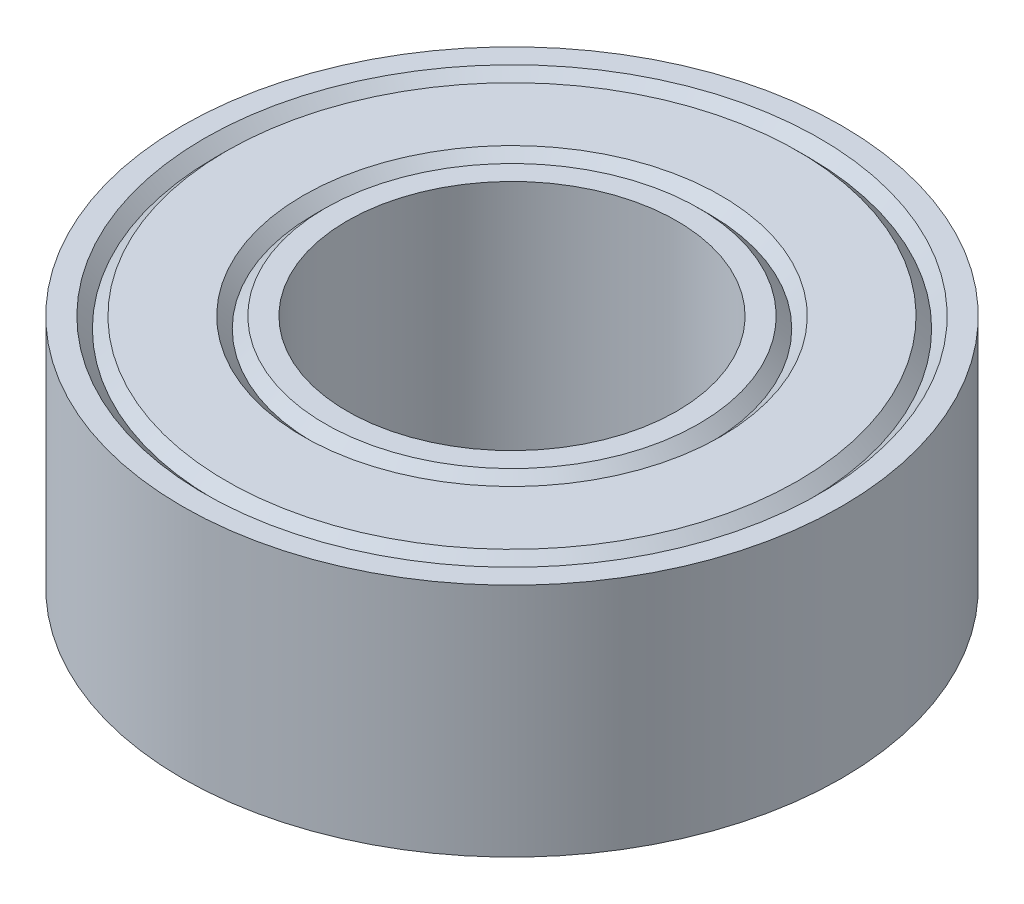
ISO-10303-21;
HEADER;
FILE_DESCRIPTION(('STEP AP214'),'2;1');
FILE_NAME('part.step','',(''),(''),'','','');
FILE_SCHEMA(('AUTOMOTIVE_DESIGN { 1 0 10303 214 1 1 1 1 }'));
ENDSEC;
DATA;
#1=APPLICATION_CONTEXT('core data for automotive mechanical design processes');
#2=APPLICATION_PROTOCOL_DEFINITION('international standard','automotive_design',2000,#1);
#3=PRODUCT_CONTEXT('',#1,'mechanical');
#4=PRODUCT('Part','Part','',(#3));
#5=PRODUCT_RELATED_PRODUCT_CATEGORY('part','',(#4));
#6=PRODUCT_DEFINITION_FORMATION('','',#4);
#7=PRODUCT_DEFINITION_CONTEXT('part definition',#1,'design');
#8=PRODUCT_DEFINITION('design','',#6,#7);
#9=PRODUCT_DEFINITION_SHAPE('','',#8);
#10=(LENGTH_UNIT() NAMED_UNIT(*) SI_UNIT(.MILLI.,.METRE.));
#11=(NAMED_UNIT(*) PLANE_ANGLE_UNIT() SI_UNIT($,.RADIAN.));
#12=(NAMED_UNIT(*) SI_UNIT($,.STERADIAN.) SOLID_ANGLE_UNIT());
#13=UNCERTAINTY_MEASURE_WITH_UNIT(LENGTH_MEASURE(1.E-05),#10,'distance_accuracy_value','');
#14=(GEOMETRIC_REPRESENTATION_CONTEXT(3) GLOBAL_UNCERTAINTY_ASSIGNED_CONTEXT((#13)) GLOBAL_UNIT_ASSIGNED_CONTEXT((#10,
#11,#12)) REPRESENTATION_CONTEXT('',''));
#15=CARTESIAN_POINT('',(0.,0.,0.));
#16=DIRECTION('',(0.,0.,1.));
#17=DIRECTION('',(1.,0.,0.));
#18=AXIS2_PLACEMENT_3D('',#15,#16,#17);
#19=CARTESIAN_POINT('',(0.,2.5,0.));
#20=DIRECTION('',(0.,1.,0.));
#21=DIRECTION('',(-1.,0.,0.));
#22=AXIS2_PLACEMENT_3D('',#19,#20,#21);
#23=CYLINDRICAL_SURFACE('',#22,3.5);
#24=CARTESIAN_POINT('',(0.,2.49999999999999,0.));
#25=DIRECTION('',(0.,1.,0.));
#26=DIRECTION('',(-1.,0.,0.));
#27=AXIS2_PLACEMENT_3D('',#24,#25,#26);
#28=CIRCLE('',#27,3.5);
#29=CARTESIAN_POINT('',(-3.5,2.49999999999999,0.));
#30=VERTEX_POINT('',#29);
#31=EDGE_CURVE('E83',#30,#30,#28,.T.);
#32=ORIENTED_EDGE('',*,*,#31,.T.);
#33=EDGE_LOOP('',(#32));
#34=FACE_BOUND('',#33,.T.);
#35=CARTESIAN_POINT('',(0.,-2.49999999999999,0.));
#36=DIRECTION('',(0.,1.,0.));
#37=DIRECTION('',(-1.,0.,0.));
#38=AXIS2_PLACEMENT_3D('',#35,#36,#37);
#39=CIRCLE('',#38,3.5);
#40=CARTESIAN_POINT('',(-3.5,-2.49999999999999,0.));
#41=VERTEX_POINT('',#40);
#42=EDGE_CURVE('E10',#41,#41,#39,.T.);
#43=ORIENTED_EDGE('',*,*,#42,.F.);
#44=EDGE_LOOP('',(#43));
#45=FACE_BOUND('',#44,.T.);
#46=ADVANCED_FACE('F31',(#34,#45),#23,.F.);
#47=CARTESIAN_POINT('',(-3.5,-2.5,0.));
#48=DIRECTION('',(0.,-1.,0.));
#49=DIRECTION('',(1.,0.,0.));
#50=AXIS2_PLACEMENT_3D('',#47,#48,#49);
#51=PLANE('',#50);
#52=ORIENTED_EDGE('',*,*,#42,.T.);
#53=EDGE_LOOP('',(#52));
#54=FACE_BOUND('',#53,.T.);
#55=CARTESIAN_POINT('',(0.,-2.5,0.));
#56=DIRECTION('',(0.,1.,0.));
#57=DIRECTION('',(-1.,0.,0.));
#58=AXIS2_PLACEMENT_3D('',#55,#56,#57);
#59=CIRCLE('',#58,3.96666666666667);
#60=CARTESIAN_POINT('',(-3.96666666666667,-2.5,0.));
#61=VERTEX_POINT('',#60);
#62=EDGE_CURVE('E37',#61,#61,#59,.T.);
#63=ORIENTED_EDGE('',*,*,#62,.F.);
#64=EDGE_LOOP('',(#63));
#65=FACE_BOUND('',#64,.T.);
#66=ADVANCED_FACE('F101',(#54,#65),#51,.T.);
#67=CARTESIAN_POINT('',(0.,-2.26666666666667,0.));
#68=DIRECTION('',(0.,1.,0.));
#69=DIRECTION('',(-1.,0.,0.));
#70=AXIS2_PLACEMENT_3D('',#67,#68,#69);
#71=CONICAL_SURFACE('',#70,4.2,0.785398163397454);
#72=ORIENTED_EDGE('',*,*,#62,.T.);
#73=EDGE_LOOP('',(#72));
#74=FACE_BOUND('',#73,.T.);
#75=CARTESIAN_POINT('',(0.,-2.26666666666667,0.));
#76=DIRECTION('',(0.,1.,0.));
#77=DIRECTION('',(-1.,0.,0.));
#78=AXIS2_PLACEMENT_3D('',#75,#76,#77);
#79=CIRCLE('',#78,4.2);
#80=CARTESIAN_POINT('',(-4.2,-2.26666666666667,0.));
#81=VERTEX_POINT('',#80);
#82=EDGE_CURVE('E41',#81,#81,#79,.T.);
#83=ORIENTED_EDGE('',*,*,#82,.F.);
#84=EDGE_LOOP('',(#83));
#85=FACE_BOUND('',#84,.T.);
#86=ADVANCED_FACE('F105',(#74,#85),#71,.T.);
#87=CARTESIAN_POINT('',(0.,-2.5,0.));
#88=DIRECTION('',(0.,-1.,0.));
#89=DIRECTION('',(1.,0.,0.));
#90=AXIS2_PLACEMENT_3D('',#87,#88,#89);
#91=CONICAL_SURFACE('',#90,4.43333333333333,0.785398163397448);
#92=ORIENTED_EDGE('',*,*,#82,.T.);
#93=EDGE_LOOP('',(#92));
#94=FACE_BOUND('',#93,.T.);
#95=CARTESIAN_POINT('',(0.,-2.5,0.));
#96=DIRECTION('',(0.,1.,0.));
#97=DIRECTION('',(-1.,0.,0.));
#98=AXIS2_PLACEMENT_3D('',#95,#96,#97);
#99=CIRCLE('',#98,4.43333333333333);
#100=CARTESIAN_POINT('',(-4.43333333333333,-2.5,0.));
#101=VERTEX_POINT('',#100);
#102=EDGE_CURVE('E45',#101,#101,#99,.T.);
#103=ORIENTED_EDGE('',*,*,#102,.F.);
#104=EDGE_LOOP('',(#103));
#105=FACE_BOUND('',#104,.T.);
#106=ADVANCED_FACE('F109',(#94,#105),#91,.F.);
#107=CARTESIAN_POINT('',(-4.43333333333333,-2.5,0.));
#108=DIRECTION('',(0.,-1.,0.));
#109=DIRECTION('',(1.,0.,0.));
#110=AXIS2_PLACEMENT_3D('',#107,#108,#109);
#111=PLANE('',#110);
#112=ORIENTED_EDGE('',*,*,#102,.T.);
#113=EDGE_LOOP('',(#112));
#114=FACE_BOUND('',#113,.T.);
#115=CARTESIAN_POINT('',(0.,-2.5,0.));
#116=DIRECTION('',(0.,1.,0.));
#117=DIRECTION('',(-1.,0.,0.));
#118=AXIS2_PLACEMENT_3D('',#115,#116,#117);
#119=CIRCLE('',#118,6.06666666666667);
#120=CARTESIAN_POINT('',(-6.06666666666667,-2.5,0.));
#121=VERTEX_POINT('',#120);
#122=EDGE_CURVE('E50',#121,#121,#119,.T.);
#123=ORIENTED_EDGE('',*,*,#122,.F.);
#124=EDGE_LOOP('',(#123));
#125=FACE_BOUND('',#124,.T.);
#126=ADVANCED_FACE('F115',(#114,#125),#111,.T.);
#127=CARTESIAN_POINT('',(0.,-2.26666666666667,0.));
#128=DIRECTION('',(0.,1.,0.));
#129=DIRECTION('',(-1.,0.,0.));
#130=AXIS2_PLACEMENT_3D('',#127,#128,#129);
#131=CONICAL_SURFACE('',#130,6.30000000000001,0.785398163397458);
#132=ORIENTED_EDGE('',*,*,#122,.T.);
#133=EDGE_LOOP('',(#132));
#134=FACE_BOUND('',#133,.T.);
#135=CARTESIAN_POINT('',(0.,-2.26666666666667,0.));
#136=DIRECTION('',(0.,1.,0.));
#137=DIRECTION('',(-1.,0.,0.));
#138=AXIS2_PLACEMENT_3D('',#135,#136,#137);
#139=CIRCLE('',#138,6.30000000000001);
#140=CARTESIAN_POINT('',(-6.30000000000001,-2.26666666666667,0.));
#141=VERTEX_POINT('',#140);
#142=EDGE_CURVE('E53',#141,#141,#139,.T.);
#143=ORIENTED_EDGE('',*,*,#142,.F.);
#144=EDGE_LOOP('',(#143));
#145=FACE_BOUND('',#144,.T.);
#146=ADVANCED_FACE('F119',(#134,#145),#131,.T.);
#147=CARTESIAN_POINT('',(0.,-2.5,0.));
#148=DIRECTION('',(0.,-1.,0.));
#149=DIRECTION('',(1.,0.,0.));
#150=AXIS2_PLACEMENT_3D('',#147,#148,#149);
#151=CONICAL_SURFACE('',#150,6.53333333333334,0.785398163397447);
#152=ORIENTED_EDGE('',*,*,#142,.T.);
#153=EDGE_LOOP('',(#152));
#154=FACE_BOUND('',#153,.T.);
#155=CARTESIAN_POINT('',(0.,-2.5,0.));
#156=DIRECTION('',(0.,1.,0.));
#157=DIRECTION('',(-1.,0.,0.));
#158=AXIS2_PLACEMENT_3D('',#155,#156,#157);
#159=CIRCLE('',#158,6.53333333333334);
#160=CARTESIAN_POINT('',(-6.53333333333334,-2.5,0.));
#161=VERTEX_POINT('',#160);
#162=EDGE_CURVE('E56',#161,#161,#159,.T.);
#163=ORIENTED_EDGE('',*,*,#162,.F.);
#164=EDGE_LOOP('',(#163));
#165=FACE_BOUND('',#164,.T.);
#166=ADVANCED_FACE('F123',(#154,#165),#151,.F.);
#167=CARTESIAN_POINT('',(-6.53333333333334,-2.5,0.));
#168=DIRECTION('',(0.,-1.,0.));
#169=DIRECTION('',(1.,0.,0.));
#170=AXIS2_PLACEMENT_3D('',#167,#168,#169);
#171=PLANE('',#170);
#172=ORIENTED_EDGE('',*,*,#162,.T.);
#173=EDGE_LOOP('',(#172));
#174=FACE_BOUND('',#173,.T.);
#175=CARTESIAN_POINT('',(0.,-2.5,0.));
#176=DIRECTION('',(0.,1.,0.));
#177=DIRECTION('',(-1.,0.,0.));
#178=AXIS2_PLACEMENT_3D('',#175,#176,#177);
#179=CIRCLE('',#178,7.);
#180=CARTESIAN_POINT('',(-7.,-2.5,0.));
#181=VERTEX_POINT('',#180);
#182=EDGE_CURVE('E59',#181,#181,#179,.T.);
#183=ORIENTED_EDGE('',*,*,#182,.F.);
#184=EDGE_LOOP('',(#183));
#185=FACE_BOUND('',#184,.T.);
#186=ADVANCED_FACE('F127',(#174,#185),#171,.T.);
#187=CARTESIAN_POINT('',(0.,2.5,0.));
#188=DIRECTION('',(0.,1.,0.));
#189=DIRECTION('',(-1.,0.,0.));
#190=AXIS2_PLACEMENT_3D('',#187,#188,#189);
#191=CYLINDRICAL_SURFACE('',#190,7.);
#192=ORIENTED_EDGE('',*,*,#182,.T.);
#193=EDGE_LOOP('',(#192));
#194=FACE_BOUND('',#193,.T.);
#195=CARTESIAN_POINT('',(0.,2.5,0.));
#196=DIRECTION('',(0.,1.,0.));
#197=DIRECTION('',(-1.,0.,0.));
#198=AXIS2_PLACEMENT_3D('',#195,#196,#197);
#199=CIRCLE('',#198,7.);
#200=CARTESIAN_POINT('',(-7.,2.5,0.));
#201=VERTEX_POINT('',#200);
#202=EDGE_CURVE('E62',#201,#201,#199,.T.);
#203=ORIENTED_EDGE('',*,*,#202,.F.);
#204=EDGE_LOOP('',(#203));
#205=FACE_BOUND('',#204,.T.);
#206=ADVANCED_FACE('F131',(#194,#205),#191,.T.);
#207=CARTESIAN_POINT('',(-6.53333333333334,2.5,0.));
#208=DIRECTION('',(0.,1.,0.));
#209=DIRECTION('',(-1.,0.,0.));
#210=AXIS2_PLACEMENT_3D('',#207,#208,#209);
#211=PLANE('',#210);
#212=ORIENTED_EDGE('',*,*,#202,.T.);
#213=EDGE_LOOP('',(#212));
#214=FACE_BOUND('',#213,.T.);
#215=CARTESIAN_POINT('',(0.,2.5,0.));
#216=DIRECTION('',(0.,1.,0.));
#217=DIRECTION('',(-1.,0.,0.));
#218=AXIS2_PLACEMENT_3D('',#215,#216,#217);
#219=CIRCLE('',#218,6.53333333333334);
#220=CARTESIAN_POINT('',(-6.53333333333334,2.5,0.));
#221=VERTEX_POINT('',#220);
#222=EDGE_CURVE('E65',#221,#221,#219,.T.);
#223=ORIENTED_EDGE('',*,*,#222,.F.);
#224=EDGE_LOOP('',(#223));
#225=FACE_BOUND('',#224,.T.);
#226=ADVANCED_FACE('F135',(#214,#225),#211,.T.);
#227=CARTESIAN_POINT('',(0.,2.26666666666667,0.));
#228=DIRECTION('',(0.,1.,0.));
#229=DIRECTION('',(-1.,0.,0.));
#230=AXIS2_PLACEMENT_3D('',#227,#228,#229);
#231=CONICAL_SURFACE('',#230,6.30000000000001,0.785398163397447);
#232=ORIENTED_EDGE('',*,*,#222,.T.);
#233=EDGE_LOOP('',(#232));
#234=FACE_BOUND('',#233,.T.);
#235=CARTESIAN_POINT('',(0.,2.26666666666667,0.));
#236=DIRECTION('',(0.,1.,0.));
#237=DIRECTION('',(-1.,0.,0.));
#238=AXIS2_PLACEMENT_3D('',#235,#236,#237);
#239=CIRCLE('',#238,6.30000000000001);
#240=CARTESIAN_POINT('',(-6.30000000000001,2.26666666666667,0.));
#241=VERTEX_POINT('',#240);
#242=EDGE_CURVE('E68',#241,#241,#239,.T.);
#243=ORIENTED_EDGE('',*,*,#242,.F.);
#244=EDGE_LOOP('',(#243));
#245=FACE_BOUND('',#244,.T.);
#246=ADVANCED_FACE('F139',(#234,#245),#231,.F.);
#247=CARTESIAN_POINT('',(0.,2.5,0.));
#248=DIRECTION('',(0.,-1.,0.));
#249=DIRECTION('',(1.,0.,0.));
#250=AXIS2_PLACEMENT_3D('',#247,#248,#249);
#251=CONICAL_SURFACE('',#250,6.06666666666667,0.78539816339746);
#252=ORIENTED_EDGE('',*,*,#242,.T.);
#253=EDGE_LOOP('',(#252));
#254=FACE_BOUND('',#253,.T.);
#255=CARTESIAN_POINT('',(0.,2.5,0.));
#256=DIRECTION('',(0.,1.,0.));
#257=DIRECTION('',(-1.,0.,0.));
#258=AXIS2_PLACEMENT_3D('',#255,#256,#257);
#259=CIRCLE('',#258,6.06666666666667);
#260=CARTESIAN_POINT('',(-6.06666666666667,2.5,0.));
#261=VERTEX_POINT('',#260);
#262=EDGE_CURVE('E71',#261,#261,#259,.T.);
#263=ORIENTED_EDGE('',*,*,#262,.F.);
#264=EDGE_LOOP('',(#263));
#265=FACE_BOUND('',#264,.T.);
#266=ADVANCED_FACE('F143',(#254,#265),#251,.T.);
#267=CARTESIAN_POINT('',(-4.43333333333333,2.5,0.));
#268=DIRECTION('',(0.,1.,0.));
#269=DIRECTION('',(-1.,0.,0.));
#270=AXIS2_PLACEMENT_3D('',#267,#268,#269);
#271=PLANE('',#270);
#272=ORIENTED_EDGE('',*,*,#262,.T.);
#273=EDGE_LOOP('',(#272));
#274=FACE_BOUND('',#273,.T.);
#275=CARTESIAN_POINT('',(0.,2.5,0.));
#276=DIRECTION('',(0.,1.,0.));
#277=DIRECTION('',(-1.,0.,0.));
#278=AXIS2_PLACEMENT_3D('',#275,#276,#277);
#279=CIRCLE('',#278,4.43333333333333);
#280=CARTESIAN_POINT('',(-4.43333333333333,2.5,0.));
#281=VERTEX_POINT('',#280);
#282=EDGE_CURVE('E74',#281,#281,#279,.T.);
#283=ORIENTED_EDGE('',*,*,#282,.F.);
#284=EDGE_LOOP('',(#283));
#285=FACE_BOUND('',#284,.T.);
#286=ADVANCED_FACE('F147',(#274,#285),#271,.T.);
#287=CARTESIAN_POINT('',(0.,2.26666666666667,0.));
#288=DIRECTION('',(0.,1.,0.));
#289=DIRECTION('',(-1.,0.,0.));
#290=AXIS2_PLACEMENT_3D('',#287,#288,#289);
#291=CONICAL_SURFACE('',#290,4.2,0.785398163397448);
#292=ORIENTED_EDGE('',*,*,#282,.T.);
#293=EDGE_LOOP('',(#292));
#294=FACE_BOUND('',#293,.T.);
#295=CARTESIAN_POINT('',(0.,2.26666666666667,0.));
#296=DIRECTION('',(0.,1.,0.));
#297=DIRECTION('',(-1.,0.,0.));
#298=AXIS2_PLACEMENT_3D('',#295,#296,#297);
#299=CIRCLE('',#298,4.2);
#300=CARTESIAN_POINT('',(-4.2,2.26666666666667,0.));
#301=VERTEX_POINT('',#300);
#302=EDGE_CURVE('E77',#301,#301,#299,.T.);
#303=ORIENTED_EDGE('',*,*,#302,.F.);
#304=EDGE_LOOP('',(#303));
#305=FACE_BOUND('',#304,.T.);
#306=ADVANCED_FACE('F97',(#294,#305),#291,.F.);
#307=CARTESIAN_POINT('',(0.,2.5,0.));
#308=DIRECTION('',(0.,-1.,0.));
#309=DIRECTION('',(1.,0.,0.));
#310=AXIS2_PLACEMENT_3D('',#307,#308,#309);
#311=CONICAL_SURFACE('',#310,3.96666666666667,0.785398163397449);
#312=ORIENTED_EDGE('',*,*,#302,.T.);
#313=EDGE_LOOP('',(#312));
#314=FACE_BOUND('',#313,.T.);
#315=CARTESIAN_POINT('',(0.,2.5,0.));
#316=DIRECTION('',(0.,1.,0.));
#317=DIRECTION('',(-1.,0.,0.));
#318=AXIS2_PLACEMENT_3D('',#315,#316,#317);
#319=CIRCLE('',#318,3.96666666666667);
#320=CARTESIAN_POINT('',(-3.96666666666667,2.5,0.));
#321=VERTEX_POINT('',#320);
#322=EDGE_CURVE('E80',#321,#321,#319,.T.);
#323=ORIENTED_EDGE('',*,*,#322,.F.);
#324=EDGE_LOOP('',(#323));
#325=FACE_BOUND('',#324,.T.);
#326=ADVANCED_FACE('F91',(#314,#325),#311,.T.);
#327=CARTESIAN_POINT('',(-3.5,2.5,0.));
#328=DIRECTION('',(0.,1.,0.));
#329=DIRECTION('',(-1.,0.,0.));
#330=AXIS2_PLACEMENT_3D('',#327,#328,#329);
#331=PLANE('',#330);
#332=ORIENTED_EDGE('',*,*,#322,.T.);
#333=EDGE_LOOP('',(#332));
#334=FACE_BOUND('',#333,.T.);
#335=ORIENTED_EDGE('',*,*,#31,.F.);
#336=EDGE_LOOP('',(#335));
#337=FACE_BOUND('',#336,.T.);
#338=ADVANCED_FACE('F89',(#334,#337),#331,.T.);
#339=CLOSED_SHELL('',(#46,#66,#86,#106,#126,#146,#166,#186,#206,#226,#246,#266,#286,#306,#326,#338));
#340=MANIFOLD_SOLID_BREP('B2',#339);
#341=ADVANCED_BREP_SHAPE_REPRESENTATION('',(#18,#340),#14);
#342=SHAPE_DEFINITION_REPRESENTATION(#9,#341);
ENDSEC;
END-ISO-10303-21;
